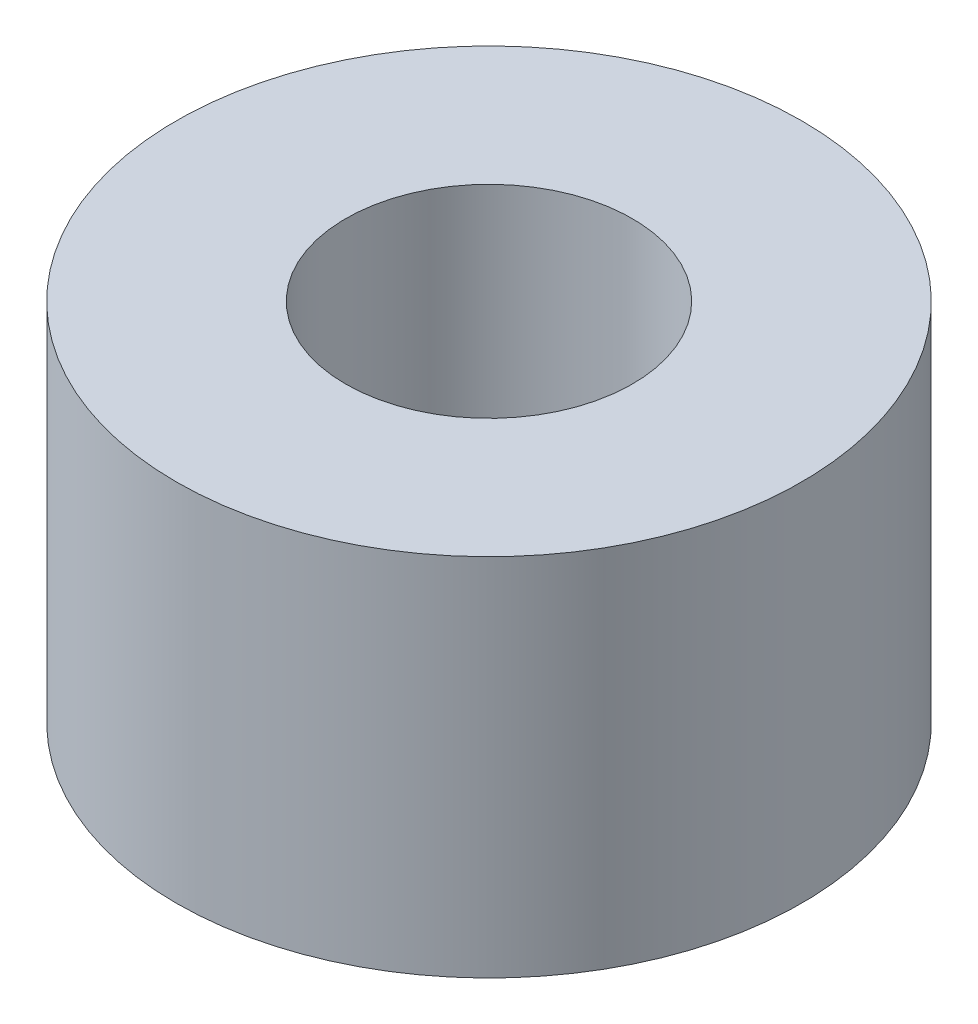
ISO-10303-21;
HEADER;
FILE_DESCRIPTION(('STEP AP214'),'2;1');
FILE_NAME('part.step','',(''),(''),'','','');
FILE_SCHEMA(('AUTOMOTIVE_DESIGN { 1 0 10303 214 1 1 1 1 }'));
ENDSEC;
DATA;
#1=APPLICATION_CONTEXT('core data for automotive mechanical design processes');
#2=APPLICATION_PROTOCOL_DEFINITION('international standard','automotive_design',2000,#1);
#3=PRODUCT_CONTEXT('',#1,'mechanical');
#4=PRODUCT('Part','Part','',(#3));
#5=PRODUCT_RELATED_PRODUCT_CATEGORY('part','',(#4));
#6=PRODUCT_DEFINITION_FORMATION('','',#4);
#7=PRODUCT_DEFINITION_CONTEXT('part definition',#1,'design');
#8=PRODUCT_DEFINITION('design','',#6,#7);
#9=PRODUCT_DEFINITION_SHAPE('','',#8);
#10=(LENGTH_UNIT() NAMED_UNIT(*) SI_UNIT(.MILLI.,.METRE.));
#11=(NAMED_UNIT(*) PLANE_ANGLE_UNIT() SI_UNIT($,.RADIAN.));
#12=(NAMED_UNIT(*) SI_UNIT($,.STERADIAN.) SOLID_ANGLE_UNIT());
#13=UNCERTAINTY_MEASURE_WITH_UNIT(LENGTH_MEASURE(1.E-05),#10,'distance_accuracy_value','');
#14=(GEOMETRIC_REPRESENTATION_CONTEXT(3) GLOBAL_UNCERTAINTY_ASSIGNED_CONTEXT((#13)) GLOBAL_UNIT_ASSIGNED_CONTEXT((#10,
#11,#12)) REPRESENTATION_CONTEXT('',''));
#15=CARTESIAN_POINT('',(0.,0.,0.));
#16=DIRECTION('',(0.,0.,1.));
#17=DIRECTION('',(1.,0.,0.));
#18=AXIS2_PLACEMENT_3D('',#15,#16,#17);
#19=CARTESIAN_POINT('',(0.,2.8,0.));
#20=DIRECTION('',(0.,1.,0.));
#21=DIRECTION('',(0.,0.,1.));
#22=AXIS2_PLACEMENT_3D('',#19,#20,#21);
#23=PLANE('',#22);
#24=CARTESIAN_POINT('',(0.,2.8,0.));
#25=DIRECTION('',(0.,1.,0.));
#26=DIRECTION('',(0.,0.,1.));
#27=AXIS2_PLACEMENT_3D('',#24,#25,#26);
#28=CIRCLE('',#27,2.4);
#29=CARTESIAN_POINT('',(0.,2.8,2.4));
#30=VERTEX_POINT('',#29);
#31=EDGE_CURVE('E10',#30,#30,#28,.T.);
#32=ORIENTED_EDGE('',*,*,#31,.T.);
#33=EDGE_LOOP('',(#32));
#34=FACE_BOUND('',#33,.T.);
#35=CARTESIAN_POINT('',(0.,2.8,0.));
#36=DIRECTION('',(0.,1.,0.));
#37=DIRECTION('',(0.,0.,1.));
#38=AXIS2_PLACEMENT_3D('',#35,#36,#37);
#39=CIRCLE('',#38,1.1);
#40=CARTESIAN_POINT('',(0.,2.8,1.1));
#41=VERTEX_POINT('',#40);
#42=EDGE_CURVE('E43',#41,#41,#39,.T.);
#43=ORIENTED_EDGE('',*,*,#42,.F.);
#44=EDGE_LOOP('',(#43));
#45=FACE_BOUND('',#44,.T.);
#46=ADVANCED_FACE('F32',(#34,#45),#23,.T.);
#47=CARTESIAN_POINT('',(0.,0.,0.));
#48=DIRECTION('',(0.,1.,0.));
#49=DIRECTION('',(0.,0.,1.));
#50=AXIS2_PLACEMENT_3D('',#47,#48,#49);
#51=PLANE('',#50);
#52=CARTESIAN_POINT('',(0.,0.,0.));
#53=DIRECTION('',(0.,1.,0.));
#54=DIRECTION('',(0.,0.,1.));
#55=AXIS2_PLACEMENT_3D('',#52,#53,#54);
#56=CIRCLE('',#55,2.4);
#57=CARTESIAN_POINT('',(0.,0.,2.4));
#58=VERTEX_POINT('',#57);
#59=EDGE_CURVE('E36',#58,#58,#56,.T.);
#60=ORIENTED_EDGE('',*,*,#59,.F.);
#61=EDGE_LOOP('',(#60));
#62=FACE_BOUND('',#61,.T.);
#63=CARTESIAN_POINT('',(0.,0.,0.));
#64=DIRECTION('',(0.,1.,0.));
#65=DIRECTION('',(0.,0.,1.));
#66=AXIS2_PLACEMENT_3D('',#63,#64,#65);
#67=CIRCLE('',#66,1.1);
#68=CARTESIAN_POINT('',(0.,0.,1.1));
#69=VERTEX_POINT('',#68);
#70=EDGE_CURVE('E45',#69,#69,#67,.T.);
#71=ORIENTED_EDGE('',*,*,#70,.T.);
#72=EDGE_LOOP('',(#71));
#73=FACE_BOUND('',#72,.T.);
#74=ADVANCED_FACE('F55',(#62,#73),#51,.F.);
#75=CARTESIAN_POINT('',(0.,2.8,0.));
#76=DIRECTION('',(0.,-1.,0.));
#77=DIRECTION('',(0.,0.,-1.));
#78=AXIS2_PLACEMENT_3D('',#75,#76,#77);
#79=CYLINDRICAL_SURFACE('',#78,2.4);
#80=ORIENTED_EDGE('',*,*,#31,.F.);
#81=EDGE_LOOP('',(#80));
#82=FACE_BOUND('',#81,.T.);
#83=ORIENTED_EDGE('',*,*,#59,.T.);
#84=EDGE_LOOP('',(#83));
#85=FACE_BOUND('',#84,.T.);
#86=ADVANCED_FACE('F34',(#82,#85),#79,.T.);
#87=CARTESIAN_POINT('',(0.,2.8,0.));
#88=DIRECTION('',(0.,-1.,0.));
#89=DIRECTION('',(0.,0.,-1.));
#90=AXIS2_PLACEMENT_3D('',#87,#88,#89);
#91=CYLINDRICAL_SURFACE('',#90,1.1);
#92=ORIENTED_EDGE('',*,*,#42,.T.);
#93=EDGE_LOOP('',(#92));
#94=FACE_BOUND('',#93,.T.);
#95=ORIENTED_EDGE('',*,*,#70,.F.);
#96=EDGE_LOOP('',(#95));
#97=FACE_BOUND('',#96,.T.);
#98=ADVANCED_FACE('F51',(#94,#97),#91,.F.);
#99=CLOSED_SHELL('',(#46,#74,#86,#98));
#100=MANIFOLD_SOLID_BREP('B2',#99);
#101=ADVANCED_BREP_SHAPE_REPRESENTATION('',(#18,#100),#14);
#102=SHAPE_DEFINITION_REPRESENTATION(#9,#101);
ENDSEC;
END-ISO-10303-21;
